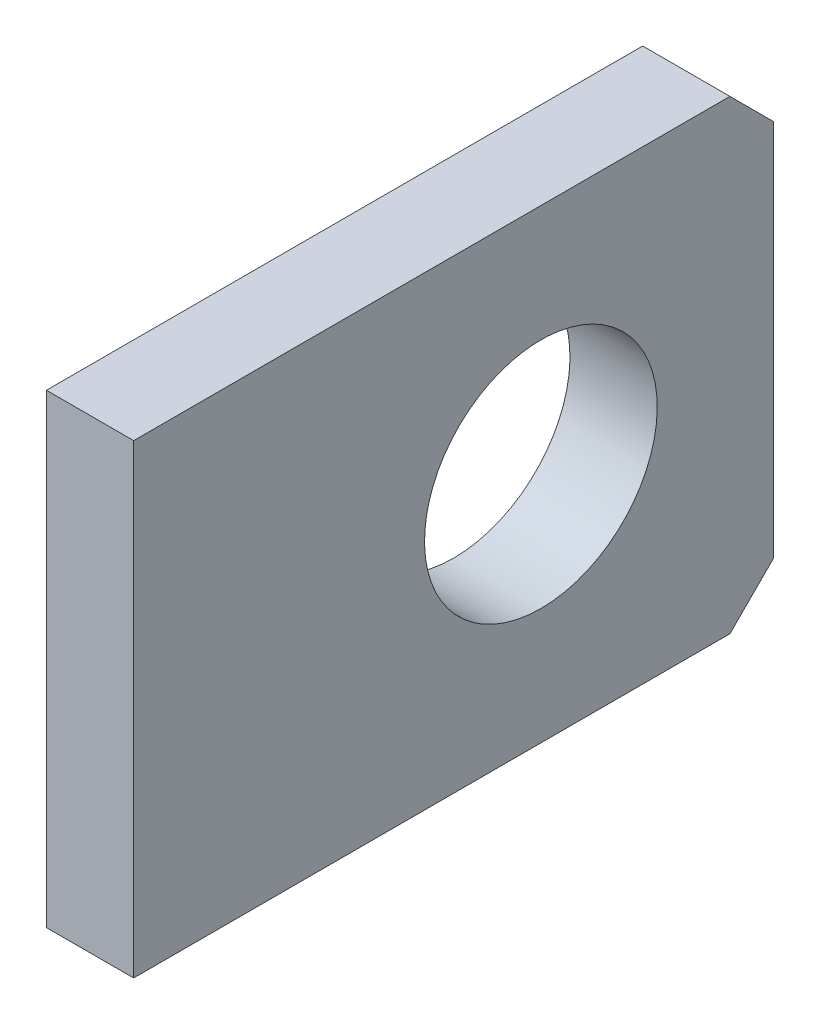
ISO-10303-21;
HEADER;
FILE_DESCRIPTION(('STEP AP214'),'2;1');
FILE_NAME('part.step','',(''),(''),'','','');
FILE_SCHEMA(('AUTOMOTIVE_DESIGN { 1 0 10303 214 1 1 1 1 }'));
ENDSEC;
DATA;
#1=APPLICATION_CONTEXT('core data for automotive mechanical design processes');
#2=APPLICATION_PROTOCOL_DEFINITION('international standard','automotive_design',2000,#1);
#3=PRODUCT_CONTEXT('',#1,'mechanical');
#4=PRODUCT('Part','Part','',(#3));
#5=PRODUCT_RELATED_PRODUCT_CATEGORY('part','',(#4));
#6=PRODUCT_DEFINITION_FORMATION('','',#4);
#7=PRODUCT_DEFINITION_CONTEXT('part definition',#1,'design');
#8=PRODUCT_DEFINITION('design','',#6,#7);
#9=PRODUCT_DEFINITION_SHAPE('','',#8);
#10=(LENGTH_UNIT() NAMED_UNIT(*) SI_UNIT(.MILLI.,.METRE.));
#11=(NAMED_UNIT(*) PLANE_ANGLE_UNIT() SI_UNIT($,.RADIAN.));
#12=(NAMED_UNIT(*) SI_UNIT($,.STERADIAN.) SOLID_ANGLE_UNIT());
#13=UNCERTAINTY_MEASURE_WITH_UNIT(LENGTH_MEASURE(1.E-05),#10,'distance_accuracy_value','');
#14=(GEOMETRIC_REPRESENTATION_CONTEXT(3) GLOBAL_UNCERTAINTY_ASSIGNED_CONTEXT((#13)) GLOBAL_UNIT_ASSIGNED_CONTEXT((#10,
#11,#12)) REPRESENTATION_CONTEXT('',''));
#15=CARTESIAN_POINT('',(0.,0.,0.));
#16=DIRECTION('',(0.,0.,1.));
#17=DIRECTION('',(1.,0.,0.));
#18=AXIS2_PLACEMENT_3D('',#15,#16,#17);
#19=CARTESIAN_POINT('',(-0.3,-1.6,0.));
#20=DIRECTION('',(-1.,0.,0.));
#21=DIRECTION('',(0.,0.,1.));
#22=AXIS2_PLACEMENT_3D('',#19,#20,#21);
#23=PLANE('',#22);
#24=CARTESIAN_POINT('',(-0.3,0.,-2.3));
#25=DIRECTION('',(-1.,0.,0.));
#26=DIRECTION('',(0.,-1.,0.));
#27=AXIS2_PLACEMENT_3D('',#24,#25,#26);
#28=CIRCLE('',#27,0.8);
#29=CARTESIAN_POINT('',(-0.3,-0.8,-2.3));
#30=VERTEX_POINT('',#29);
#31=EDGE_CURVE('E20',#30,#30,#28,.F.);
#32=ORIENTED_EDGE('',*,*,#31,.T.);
#33=EDGE_LOOP('',(#32));
#34=FACE_BOUND('',#33,.T.);
#35=DIRECTION('',(0.,0.707106781186546,-0.707106781186549));
#36=VECTOR('',#35,1.);
#37=CARTESIAN_POINT('',(-0.3,-1.6,-3.6));
#38=LINE('',#37,#36);
#39=CARTESIAN_POINT('',(-0.3,-1.6,-3.6));
#40=VERTEX_POINT('',#39);
#41=CARTESIAN_POINT('',(-0.3,-1.3,-3.9));
#42=VERTEX_POINT('',#41);
#43=EDGE_CURVE('E66',#40,#42,#38,.T.);
#44=ORIENTED_EDGE('',*,*,#43,.F.);
#45=DIRECTION('',(0.,0.,-1.));
#46=VECTOR('',#45,1.);
#47=CARTESIAN_POINT('',(-0.3,-1.6,0.));
#48=LINE('',#47,#46);
#49=CARTESIAN_POINT('',(-0.3,-1.6,0.5));
#50=VERTEX_POINT('',#49);
#51=EDGE_CURVE('E81',#50,#40,#48,.T.);
#52=ORIENTED_EDGE('',*,*,#51,.F.);
#53=DIRECTION('',(0.,1.,0.));
#54=VECTOR('',#53,1.);
#55=CARTESIAN_POINT('',(-0.300000000000001,0.,0.5));
#56=LINE('',#55,#54);
#57=CARTESIAN_POINT('',(-0.3,1.6,0.5));
#58=VERTEX_POINT('',#57);
#59=EDGE_CURVE('E71',#58,#50,#56,.F.);
#60=ORIENTED_EDGE('',*,*,#59,.F.);
#61=DIRECTION('',(0.,0.,1.));
#62=VECTOR('',#61,1.);
#63=CARTESIAN_POINT('',(-0.3,1.6,0.));
#64=LINE('',#63,#62);
#65=CARTESIAN_POINT('',(-0.3,1.6,-3.6));
#66=VERTEX_POINT('',#65);
#67=EDGE_CURVE('E107',#66,#58,#64,.T.);
#68=ORIENTED_EDGE('',*,*,#67,.F.);
#69=DIRECTION('',(0.,0.707106781186547,0.707106781186548));
#70=VECTOR('',#69,1.);
#71=CARTESIAN_POINT('',(-0.3,1.3,-3.9));
#72=LINE('',#71,#70);
#73=CARTESIAN_POINT('',(-0.3,1.3,-3.9));
#74=VERTEX_POINT('',#73);
#75=EDGE_CURVE('E100',#74,#66,#72,.T.);
#76=ORIENTED_EDGE('',*,*,#75,.F.);
#77=DIRECTION('',(0.,1.,0.));
#78=VECTOR('',#77,1.);
#79=CARTESIAN_POINT('',(-0.3,-1.3,-3.9));
#80=LINE('',#79,#78);
#81=EDGE_CURVE('E94',#42,#74,#80,.T.);
#82=ORIENTED_EDGE('',*,*,#81,.F.);
#83=EDGE_LOOP('',(#44,#52,#60,#68,#76,#82));
#84=FACE_BOUND('',#83,.T.);
#85=ADVANCED_FACE('F17',(#34,#84),#23,.T.);
#86=CARTESIAN_POINT('',(0.,0.,0.5));
#87=DIRECTION('',(0.,0.,1.));
#88=DIRECTION('',(1.,0.,0.));
#89=AXIS2_PLACEMENT_3D('',#86,#87,#88);
#90=PLANE('',#89);
#91=ORIENTED_EDGE('',*,*,#59,.T.);
#92=DIRECTION('',(1.,0.,0.));
#93=VECTOR('',#92,1.);
#94=CARTESIAN_POINT('',(0.3,-1.6,0.5));
#95=LINE('',#94,#93);
#96=CARTESIAN_POINT('',(0.3,-1.6,0.5));
#97=VERTEX_POINT('',#96);
#98=EDGE_CURVE('E74',#97,#50,#95,.F.);
#99=ORIENTED_EDGE('',*,*,#98,.F.);
#100=DIRECTION('',(0.,1.,0.));
#101=VECTOR('',#100,1.);
#102=CARTESIAN_POINT('',(0.299999999999999,1.6,0.5));
#103=LINE('',#102,#101);
#104=CARTESIAN_POINT('',(0.299999999999999,1.6,0.5));
#105=VERTEX_POINT('',#104);
#106=EDGE_CURVE('E109',#105,#97,#103,.F.);
#107=ORIENTED_EDGE('',*,*,#106,.F.);
#108=DIRECTION('',(1.,0.,0.));
#109=VECTOR('',#108,1.);
#110=CARTESIAN_POINT('',(-0.300000000000001,1.6,0.5));
#111=LINE('',#110,#109);
#112=EDGE_CURVE('E77',#58,#105,#111,.T.);
#113=ORIENTED_EDGE('',*,*,#112,.F.);
#114=EDGE_LOOP('',(#91,#99,#107,#113));
#115=FACE_BOUND('',#114,.T.);
#116=ADVANCED_FACE('F72',(#115),#90,.T.);
#117=CARTESIAN_POINT('',(0.3,-1.6,0.));
#118=DIRECTION('',(0.,-1.,0.));
#119=DIRECTION('',(0.,0.,-1.));
#120=AXIS2_PLACEMENT_3D('',#117,#118,#119);
#121=PLANE('',#120);
#122=DIRECTION('',(1.,0.,0.));
#123=VECTOR('',#122,1.);
#124=CARTESIAN_POINT('',(0.3,-1.6,-3.6));
#125=LINE('',#124,#123);
#126=CARTESIAN_POINT('',(0.3,-1.6,-3.6));
#127=VERTEX_POINT('',#126);
#128=EDGE_CURVE('E92',#127,#40,#125,.F.);
#129=ORIENTED_EDGE('',*,*,#128,.F.);
#130=DIRECTION('',(0.,0.,-1.));
#131=VECTOR('',#130,1.);
#132=CARTESIAN_POINT('',(0.299999999999999,-1.6,0.));
#133=LINE('',#132,#131);
#134=EDGE_CURVE('E87',#97,#127,#133,.T.);
#135=ORIENTED_EDGE('',*,*,#134,.F.);
#136=ORIENTED_EDGE('',*,*,#98,.T.);
#137=ORIENTED_EDGE('',*,*,#51,.T.);
#138=EDGE_LOOP('',(#129,#135,#136,#137));
#139=FACE_BOUND('',#138,.T.);
#140=ADVANCED_FACE('F85',(#139),#121,.T.);
#141=CARTESIAN_POINT('',(0.3,-1.6,-3.6));
#142=DIRECTION('',(0.,-0.707106781186549,-0.707106781186546));
#143=DIRECTION('',(0.,0.707106781186546,-0.707106781186549));
#144=AXIS2_PLACEMENT_3D('',#141,#142,#143);
#145=PLANE('',#144);
#146=DIRECTION('',(0.,0.707106781186547,-0.707106781186548));
#147=VECTOR('',#146,1.);
#148=CARTESIAN_POINT('',(0.299999999999999,-1.6,-3.6));
#149=LINE('',#148,#147);
#150=CARTESIAN_POINT('',(0.299999999999999,-1.3,-3.9));
#151=VERTEX_POINT('',#150);
#152=EDGE_CURVE('E112',#127,#151,#149,.T.);
#153=ORIENTED_EDGE('',*,*,#152,.F.);
#154=ORIENTED_EDGE('',*,*,#128,.T.);
#155=ORIENTED_EDGE('',*,*,#43,.T.);
#156=DIRECTION('',(-1.,0.,0.));
#157=VECTOR('',#156,1.);
#158=CARTESIAN_POINT('',(0.3,-1.3,-3.9));
#159=LINE('',#158,#157);
#160=EDGE_CURVE('E97',#151,#42,#159,.T.);
#161=ORIENTED_EDGE('',*,*,#160,.F.);
#162=EDGE_LOOP('',(#153,#154,#155,#161));
#163=FACE_BOUND('',#162,.T.);
#164=ADVANCED_FACE('F132',(#163),#145,.T.);
#165=CARTESIAN_POINT('',(0.3,-1.3,-3.9));
#166=DIRECTION('',(0.,0.,-1.));
#167=DIRECTION('',(-1.,0.,0.));
#168=AXIS2_PLACEMENT_3D('',#165,#166,#167);
#169=PLANE('',#168);
#170=DIRECTION('',(0.,1.,0.));
#171=VECTOR('',#170,1.);
#172=CARTESIAN_POINT('',(0.299999999999999,1.6,-3.9));
#173=LINE('',#172,#171);
#174=CARTESIAN_POINT('',(0.299999999999999,1.3,-3.9));
#175=VERTEX_POINT('',#174);
#176=EDGE_CURVE('E115',#151,#175,#173,.T.);
#177=ORIENTED_EDGE('',*,*,#176,.F.);
#178=ORIENTED_EDGE('',*,*,#160,.T.);
#179=ORIENTED_EDGE('',*,*,#81,.T.);
#180=DIRECTION('',(1.,0.,0.));
#181=VECTOR('',#180,1.);
#182=CARTESIAN_POINT('',(0.299999999999999,1.3,-3.9));
#183=LINE('',#182,#181);
#184=EDGE_CURVE('E102',#175,#74,#183,.F.);
#185=ORIENTED_EDGE('',*,*,#184,.F.);
#186=EDGE_LOOP('',(#177,#178,#179,#185));
#187=FACE_BOUND('',#186,.T.);
#188=ADVANCED_FACE('F128',(#187),#169,.T.);
#189=CARTESIAN_POINT('',(0.299999999999999,1.3,-3.9));
#190=DIRECTION('',(0.,0.707106781186548,-0.707106781186547));
#191=DIRECTION('',(0.,0.707106781186547,0.707106781186548));
#192=AXIS2_PLACEMENT_3D('',#189,#190,#191);
#193=PLANE('',#192);
#194=DIRECTION('',(0.,0.707106781186548,0.707106781186547));
#195=VECTOR('',#194,1.);
#196=CARTESIAN_POINT('',(0.299999999999999,1.3,-3.9));
#197=LINE('',#196,#195);
#198=CARTESIAN_POINT('',(0.299999999999999,1.6,-3.6));
#199=VERTEX_POINT('',#198);
#200=EDGE_CURVE('E118',#175,#199,#197,.T.);
#201=ORIENTED_EDGE('',*,*,#200,.F.);
#202=ORIENTED_EDGE('',*,*,#184,.T.);
#203=ORIENTED_EDGE('',*,*,#75,.T.);
#204=DIRECTION('',(1.,0.,0.));
#205=VECTOR('',#204,1.);
#206=CARTESIAN_POINT('',(-0.300000000000001,1.6,-3.6));
#207=LINE('',#206,#205);
#208=EDGE_CURVE('E34',#199,#66,#207,.F.);
#209=ORIENTED_EDGE('',*,*,#208,.F.);
#210=EDGE_LOOP('',(#201,#202,#203,#209));
#211=FACE_BOUND('',#210,.T.);
#212=ADVANCED_FACE('F129',(#211),#193,.T.);
#213=CARTESIAN_POINT('',(-0.300000000000001,1.6,0.));
#214=DIRECTION('',(0.,1.,0.));
#215=DIRECTION('',(0.,0.,1.));
#216=AXIS2_PLACEMENT_3D('',#213,#214,#215);
#217=PLANE('',#216);
#218=ORIENTED_EDGE('',*,*,#208,.T.);
#219=ORIENTED_EDGE('',*,*,#67,.T.);
#220=ORIENTED_EDGE('',*,*,#112,.T.);
#221=DIRECTION('',(0.,0.,-1.));
#222=VECTOR('',#221,1.);
#223=CARTESIAN_POINT('',(0.299999999999999,1.6,0.));
#224=LINE('',#223,#222);
#225=EDGE_CURVE('E26',#199,#105,#224,.F.);
#226=ORIENTED_EDGE('',*,*,#225,.F.);
#227=EDGE_LOOP('',(#218,#219,#220,#226));
#228=FACE_BOUND('',#227,.T.);
#229=ADVANCED_FACE('F125',(#228),#217,.T.);
#230=CARTESIAN_POINT('',(0.3,0.,-2.3));
#231=DIRECTION('',(-1.,0.,0.));
#232=DIRECTION('',(0.,-1.,0.));
#233=AXIS2_PLACEMENT_3D('',#230,#231,#232);
#234=CYLINDRICAL_SURFACE('',#233,0.8);
#235=CARTESIAN_POINT('',(0.3,0.,-2.3));
#236=DIRECTION('',(-1.,0.,0.));
#237=DIRECTION('',(0.,-1.,0.));
#238=AXIS2_PLACEMENT_3D('',#235,#236,#237);
#239=CIRCLE('',#238,0.8);
#240=CARTESIAN_POINT('',(0.3,-0.8,-2.3));
#241=VERTEX_POINT('',#240);
#242=EDGE_CURVE('E11',#241,#241,#239,.T.);
#243=ORIENTED_EDGE('',*,*,#242,.F.);
#244=EDGE_LOOP('',(#243));
#245=FACE_BOUND('',#244,.T.);
#246=ORIENTED_EDGE('',*,*,#31,.F.);
#247=EDGE_LOOP('',(#246));
#248=FACE_BOUND('',#247,.T.);
#249=ADVANCED_FACE('F143',(#245,#248),#234,.F.);
#250=CARTESIAN_POINT('',(0.299999999999999,1.6,0.));
#251=DIRECTION('',(1.,0.,0.));
#252=DIRECTION('',(0.,0.,-1.));
#253=AXIS2_PLACEMENT_3D('',#250,#251,#252);
#254=PLANE('',#253);
#255=ORIENTED_EDGE('',*,*,#242,.T.);
#256=EDGE_LOOP('',(#255));
#257=FACE_BOUND('',#256,.T.);
#258=ORIENTED_EDGE('',*,*,#200,.T.);
#259=ORIENTED_EDGE('',*,*,#225,.T.);
#260=ORIENTED_EDGE('',*,*,#106,.T.);
#261=ORIENTED_EDGE('',*,*,#134,.T.);
#262=ORIENTED_EDGE('',*,*,#152,.T.);
#263=ORIENTED_EDGE('',*,*,#176,.T.);
#264=EDGE_LOOP('',(#258,#259,#260,#261,#262,#263));
#265=FACE_BOUND('',#264,.T.);
#266=ADVANCED_FACE('F123',(#257,#265),#254,.T.);
#267=CLOSED_SHELL('',(#85,#116,#140,#164,#188,#212,#229,#249,#266));
#268=MANIFOLD_SOLID_BREP('B1',#267);
#269=ADVANCED_BREP_SHAPE_REPRESENTATION('',(#18,#268),#14);
#270=SHAPE_DEFINITION_REPRESENTATION(#9,#269);
ENDSEC;
END-ISO-10303-21;
